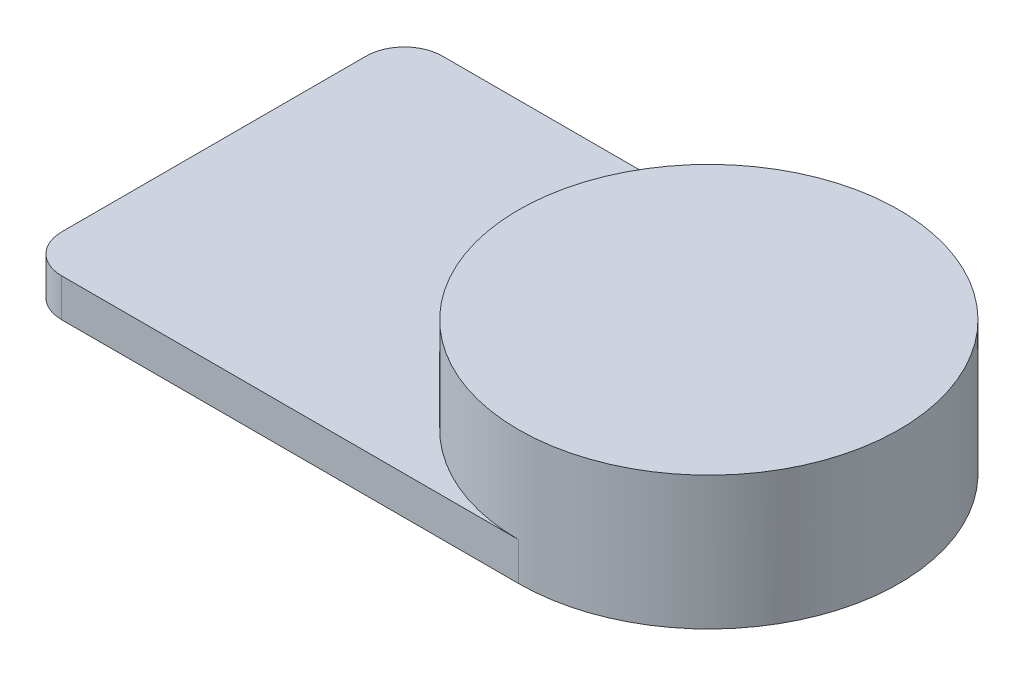
ISO-10303-21;
HEADER;
FILE_DESCRIPTION(('STEP AP214'),'2;1');
FILE_NAME('part.step','',(''),(''),'','','');
FILE_SCHEMA(('AUTOMOTIVE_DESIGN { 1 0 10303 214 1 1 1 1 }'));
ENDSEC;
DATA;
#1=APPLICATION_CONTEXT('core data for automotive mechanical design processes');
#2=APPLICATION_PROTOCOL_DEFINITION('international standard','automotive_design',2000,#1);
#3=PRODUCT_CONTEXT('',#1,'mechanical');
#4=PRODUCT('Part','Part','',(#3));
#5=PRODUCT_RELATED_PRODUCT_CATEGORY('part','',(#4));
#6=PRODUCT_DEFINITION_FORMATION('','',#4);
#7=PRODUCT_DEFINITION_CONTEXT('part definition',#1,'design');
#8=PRODUCT_DEFINITION('design','',#6,#7);
#9=PRODUCT_DEFINITION_SHAPE('','',#8);
#10=(LENGTH_UNIT() NAMED_UNIT(*) SI_UNIT(.MILLI.,.METRE.));
#11=(NAMED_UNIT(*) PLANE_ANGLE_UNIT() SI_UNIT($,.RADIAN.));
#12=(NAMED_UNIT(*) SI_UNIT($,.STERADIAN.) SOLID_ANGLE_UNIT());
#13=UNCERTAINTY_MEASURE_WITH_UNIT(LENGTH_MEASURE(1.E-05),#10,'distance_accuracy_value','');
#14=(GEOMETRIC_REPRESENTATION_CONTEXT(3) GLOBAL_UNCERTAINTY_ASSIGNED_CONTEXT((#13)) GLOBAL_UNIT_ASSIGNED_CONTEXT((#10,
#11,#12)) REPRESENTATION_CONTEXT('',''));
#15=CARTESIAN_POINT('',(0.,0.,0.));
#16=DIRECTION('',(0.,0.,1.));
#17=DIRECTION('',(1.,0.,0.));
#18=AXIS2_PLACEMENT_3D('',#15,#16,#17);
#19=CARTESIAN_POINT('',(0.,10.,50.));
#20=DIRECTION('',(0.,0.,1.));
#21=DIRECTION('',(1.,0.,0.));
#22=AXIS2_PLACEMENT_3D('',#19,#20,#21);
#23=PLANE('',#22);
#24=DIRECTION('',(-1.,0.,0.));
#25=VECTOR('',#24,1.);
#26=CARTESIAN_POINT('',(0.,10.,50.));
#27=LINE('',#26,#25);
#28=CARTESIAN_POINT('',(0.,10.,50.));
#29=VERTEX_POINT('',#28);
#30=CARTESIAN_POINT('',(-120.,10.,50.));
#31=VERTEX_POINT('',#30);
#32=EDGE_CURVE('E88',#29,#31,#27,.T.);
#33=ORIENTED_EDGE('',*,*,#32,.T.);
#34=DIRECTION('',(0.,-1.,0.));
#35=VECTOR('',#34,1.);
#36=CARTESIAN_POINT('',(-120.,0.,50.));
#37=LINE('',#36,#35);
#38=CARTESIAN_POINT('',(-120.,0.,50.));
#39=VERTEX_POINT('',#38);
#40=EDGE_CURVE('E11',#31,#39,#37,.T.);
#41=ORIENTED_EDGE('',*,*,#40,.T.);
#42=DIRECTION('',(-1.,0.,0.));
#43=VECTOR('',#42,1.);
#44=CARTESIAN_POINT('',(0.,0.,50.));
#45=LINE('',#44,#43);
#46=CARTESIAN_POINT('',(0.,0.,50.));
#47=VERTEX_POINT('',#46);
#48=EDGE_CURVE('E102',#47,#39,#45,.T.);
#49=ORIENTED_EDGE('',*,*,#48,.F.);
#50=DIRECTION('',(0.,-1.,0.));
#51=VECTOR('',#50,1.);
#52=CARTESIAN_POINT('',(0.,10.,50.));
#53=LINE('',#52,#51);
#54=EDGE_CURVE('E100',#29,#47,#53,.T.);
#55=ORIENTED_EDGE('',*,*,#54,.F.);
#56=EDGE_LOOP('',(#33,#41,#49,#55));
#57=FACE_BOUND('',#56,.T.);
#58=ADVANCED_FACE('F35',(#57),#23,.T.);
#59=CARTESIAN_POINT('',(0.,10.,0.));
#60=DIRECTION('',(0.,-1.,0.));
#61=DIRECTION('',(0.,0.,-1.));
#62=AXIS2_PLACEMENT_3D('',#59,#60,#61);
#63=CYLINDRICAL_SURFACE('',#62,50.);
#64=CARTESIAN_POINT('',(0.,0.,0.));
#65=DIRECTION('',(0.,1.,0.));
#66=DIRECTION('',(0.,0.,1.));
#67=AXIS2_PLACEMENT_3D('',#64,#65,#66);
#68=CIRCLE('',#67,50.);
#69=CARTESIAN_POINT('',(0.,0.,-50.));
#70=VERTEX_POINT('',#69);
#71=EDGE_CURVE('E122',#47,#70,#68,.T.);
#72=ORIENTED_EDGE('',*,*,#71,.T.);
#73=DIRECTION('',(0.,-1.,0.));
#74=VECTOR('',#73,1.);
#75=CARTESIAN_POINT('',(0.,10.,-50.));
#76=LINE('',#75,#74);
#77=CARTESIAN_POINT('',(0.,10.,-50.));
#78=VERTEX_POINT('',#77);
#79=EDGE_CURVE('E105',#78,#70,#76,.T.);
#80=ORIENTED_EDGE('',*,*,#79,.F.);
#81=CARTESIAN_POINT('',(0.,10.,0.));
#82=DIRECTION('',(0.,1.,0.));
#83=DIRECTION('',(0.,0.,1.));
#84=AXIS2_PLACEMENT_3D('',#81,#82,#83);
#85=CIRCLE('',#84,50.);
#86=EDGE_CURVE('E92',#78,#29,#85,.T.);
#87=ORIENTED_EDGE('',*,*,#86,.T.);
#88=ORIENTED_EDGE('',*,*,#54,.T.);
#89=EDGE_LOOP('',(#72,#80,#87,#88));
#90=FACE_BOUND('',#89,.T.);
#91=CARTESIAN_POINT('',(0.,35.,0.));
#92=DIRECTION('',(0.,1.,0.));
#93=DIRECTION('',(0.,0.,1.));
#94=AXIS2_PLACEMENT_3D('',#91,#92,#93);
#95=CIRCLE('',#94,50.);
#96=CARTESIAN_POINT('',(0.,35.,50.));
#97=VERTEX_POINT('',#96);
#98=EDGE_CURVE('E115',#97,#97,#95,.T.);
#99=ORIENTED_EDGE('',*,*,#98,.F.);
#100=EDGE_LOOP('',(#99));
#101=FACE_BOUND('',#100,.T.);
#102=ADVANCED_FACE('F107',(#90,#101),#63,.T.);
#103=CARTESIAN_POINT('',(0.,10.,-50.));
#104=DIRECTION('',(0.,0.,1.));
#105=DIRECTION('',(1.,0.,0.));
#106=AXIS2_PLACEMENT_3D('',#103,#104,#105);
#107=PLANE('',#106);
#108=DIRECTION('',(-1.,0.,0.));
#109=VECTOR('',#108,1.);
#110=CARTESIAN_POINT('',(0.,0.,-50.));
#111=LINE('',#110,#109);
#112=CARTESIAN_POINT('',(-120.,0.,-50.));
#113=VERTEX_POINT('',#112);
#114=EDGE_CURVE('E124',#70,#113,#111,.T.);
#115=ORIENTED_EDGE('',*,*,#114,.T.);
#116=DIRECTION('',(0.,-1.,0.));
#117=VECTOR('',#116,1.);
#118=CARTESIAN_POINT('',(-120.,10.,-50.));
#119=LINE('',#118,#117);
#120=CARTESIAN_POINT('',(-120.,10.,-50.));
#121=VERTEX_POINT('',#120);
#122=EDGE_CURVE('E58',#113,#121,#119,.F.);
#123=ORIENTED_EDGE('',*,*,#122,.T.);
#124=DIRECTION('',(-1.,0.,0.));
#125=VECTOR('',#124,1.);
#126=CARTESIAN_POINT('',(0.,10.,-50.));
#127=LINE('',#126,#125);
#128=EDGE_CURVE('E96',#78,#121,#127,.T.);
#129=ORIENTED_EDGE('',*,*,#128,.F.);
#130=ORIENTED_EDGE('',*,*,#79,.T.);
#131=EDGE_LOOP('',(#115,#123,#129,#130));
#132=FACE_BOUND('',#131,.T.);
#133=ADVANCED_FACE('F148',(#132),#107,.F.);
#134=CARTESIAN_POINT('',(-130.,10.,0.));
#135=DIRECTION('',(1.,0.,0.));
#136=DIRECTION('',(0.,0.,-1.));
#137=AXIS2_PLACEMENT_3D('',#134,#135,#136);
#138=PLANE('',#137);
#139=DIRECTION('',(0.,0.,1.));
#140=VECTOR('',#139,1.);
#141=CARTESIAN_POINT('',(-130.,10.,0.));
#142=LINE('',#141,#140);
#143=CARTESIAN_POINT('',(-130.,10.,-40.));
#144=VERTEX_POINT('',#143);
#145=CARTESIAN_POINT('',(-130.,10.,40.));
#146=VERTEX_POINT('',#145);
#147=EDGE_CURVE('E119',#144,#146,#142,.T.);
#148=ORIENTED_EDGE('',*,*,#147,.F.);
#149=DIRECTION('',(0.,-1.,0.));
#150=VECTOR('',#149,1.);
#151=CARTESIAN_POINT('',(-130.,10.,-40.));
#152=LINE('',#151,#150);
#153=CARTESIAN_POINT('',(-130.,0.,-40.));
#154=VERTEX_POINT('',#153);
#155=EDGE_CURVE('E112',#144,#154,#152,.T.);
#156=ORIENTED_EDGE('',*,*,#155,.T.);
#157=DIRECTION('',(0.,0.,1.));
#158=VECTOR('',#157,1.);
#159=CARTESIAN_POINT('',(-130.,0.,0.));
#160=LINE('',#159,#158);
#161=CARTESIAN_POINT('',(-130.,0.,40.));
#162=VERTEX_POINT('',#161);
#163=EDGE_CURVE('E97',#154,#162,#160,.T.);
#164=ORIENTED_EDGE('',*,*,#163,.T.);
#165=DIRECTION('',(0.,-1.,0.));
#166=VECTOR('',#165,1.);
#167=CARTESIAN_POINT('',(-130.,10.,40.));
#168=LINE('',#167,#166);
#169=EDGE_CURVE('E110',#162,#146,#168,.F.);
#170=ORIENTED_EDGE('',*,*,#169,.T.);
#171=EDGE_LOOP('',(#148,#156,#164,#170));
#172=FACE_BOUND('',#171,.T.);
#173=ADVANCED_FACE('F141',(#172),#138,.F.);
#174=CARTESIAN_POINT('',(0.,10.,0.));
#175=DIRECTION('',(0.,1.,0.));
#176=DIRECTION('',(0.,0.,1.));
#177=AXIS2_PLACEMENT_3D('',#174,#175,#176);
#178=PLANE('',#177);
#179=ORIENTED_EDGE('',*,*,#128,.T.);
#180=CARTESIAN_POINT('',(-120.,10.,-40.));
#181=DIRECTION('',(0.,1.,0.));
#182=DIRECTION('',(0.,0.,1.));
#183=AXIS2_PLACEMENT_3D('',#180,#181,#182);
#184=CIRCLE('',#183,10.);
#185=EDGE_CURVE('E43',#121,#144,#184,.T.);
#186=ORIENTED_EDGE('',*,*,#185,.T.);
#187=ORIENTED_EDGE('',*,*,#147,.T.);
#188=CARTESIAN_POINT('',(-120.,10.,40.));
#189=DIRECTION('',(0.,1.,0.));
#190=DIRECTION('',(0.,0.,1.));
#191=AXIS2_PLACEMENT_3D('',#188,#189,#190);
#192=CIRCLE('',#191,10.);
#193=EDGE_CURVE('E50',#146,#31,#192,.T.);
#194=ORIENTED_EDGE('',*,*,#193,.T.);
#195=ORIENTED_EDGE('',*,*,#32,.F.);
#196=ORIENTED_EDGE('',*,*,#86,.F.);
#197=EDGE_LOOP('',(#179,#186,#187,#194,#195,#196));
#198=FACE_BOUND('',#197,.T.);
#199=ADVANCED_FACE('F90',(#198),#178,.T.);
#200=CARTESIAN_POINT('',(0.,0.,0.));
#201=DIRECTION('',(0.,1.,0.));
#202=DIRECTION('',(0.,0.,1.));
#203=AXIS2_PLACEMENT_3D('',#200,#201,#202);
#204=PLANE('',#203);
#205=CARTESIAN_POINT('',(-115.,0.,-40.));
#206=DIRECTION('',(0.,-1.,0.));
#207=DIRECTION('',(0.,0.,-1.));
#208=AXIS2_PLACEMENT_3D('',#205,#206,#207);
#209=CIRCLE('',#208,5.00000000000001);
#210=CARTESIAN_POINT('',(-115.,0.,-45.));
#211=VERTEX_POINT('',#210);
#212=EDGE_CURVE('E202',#211,#211,#209,.T.);
#213=ORIENTED_EDGE('',*,*,#212,.F.);
#214=EDGE_LOOP('',(#213));
#215=FACE_BOUND('',#214,.T.);
#216=CARTESIAN_POINT('',(-15.,0.,-40.));
#217=DIRECTION('',(0.,-1.,0.));
#218=DIRECTION('',(0.,0.,-1.));
#219=AXIS2_PLACEMENT_3D('',#216,#217,#218);
#220=CIRCLE('',#219,5.);
#221=CARTESIAN_POINT('',(-15.,0.,-45.));
#222=VERTEX_POINT('',#221);
#223=EDGE_CURVE('E206',#222,#222,#220,.T.);
#224=ORIENTED_EDGE('',*,*,#223,.F.);
#225=EDGE_LOOP('',(#224));
#226=FACE_BOUND('',#225,.T.);
#227=CARTESIAN_POINT('',(-15.,0.,40.));
#228=DIRECTION('',(0.,-1.,0.));
#229=DIRECTION('',(0.,0.,-1.));
#230=AXIS2_PLACEMENT_3D('',#227,#228,#229);
#231=CIRCLE('',#230,5.);
#232=CARTESIAN_POINT('',(-15.,0.,35.));
#233=VERTEX_POINT('',#232);
#234=EDGE_CURVE('E210',#233,#233,#231,.T.);
#235=ORIENTED_EDGE('',*,*,#234,.F.);
#236=EDGE_LOOP('',(#235));
#237=FACE_BOUND('',#236,.T.);
#238=CARTESIAN_POINT('',(-115.,0.,40.));
#239=DIRECTION('',(0.,-1.,0.));
#240=DIRECTION('',(0.,0.,-1.));
#241=AXIS2_PLACEMENT_3D('',#238,#239,#240);
#242=CIRCLE('',#241,5.00000000000001);
#243=CARTESIAN_POINT('',(-115.,0.,35.));
#244=VERTEX_POINT('',#243);
#245=EDGE_CURVE('E213',#244,#244,#242,.T.);
#246=ORIENTED_EDGE('',*,*,#245,.F.);
#247=EDGE_LOOP('',(#246));
#248=FACE_BOUND('',#247,.T.);
#249=ORIENTED_EDGE('',*,*,#163,.F.);
#250=CARTESIAN_POINT('',(-120.,0.,-40.));
#251=DIRECTION('',(0.,1.,0.));
#252=DIRECTION('',(0.,0.,1.));
#253=AXIS2_PLACEMENT_3D('',#250,#251,#252);
#254=CIRCLE('',#253,10.);
#255=EDGE_CURVE('E133',#154,#113,#254,.F.);
#256=ORIENTED_EDGE('',*,*,#255,.T.);
#257=ORIENTED_EDGE('',*,*,#114,.F.);
#258=ORIENTED_EDGE('',*,*,#71,.F.);
#259=ORIENTED_EDGE('',*,*,#48,.T.);
#260=CARTESIAN_POINT('',(-120.,0.,40.));
#261=DIRECTION('',(0.,1.,0.));
#262=DIRECTION('',(0.,0.,1.));
#263=AXIS2_PLACEMENT_3D('',#260,#261,#262);
#264=CIRCLE('',#263,10.);
#265=EDGE_CURVE('E131',#39,#162,#264,.F.);
#266=ORIENTED_EDGE('',*,*,#265,.T.);
#267=EDGE_LOOP('',(#249,#256,#257,#258,#259,#266));
#268=FACE_BOUND('',#267,.T.);
#269=ADVANCED_FACE('F147',(#215,#226,#237,#248,#268),#204,.F.);
#270=CARTESIAN_POINT('',(0.,35.,0.));
#271=DIRECTION('',(0.,1.,0.));
#272=DIRECTION('',(0.,0.,1.));
#273=AXIS2_PLACEMENT_3D('',#270,#271,#272);
#274=PLANE('',#273);
#275=ORIENTED_EDGE('',*,*,#98,.T.);
#276=EDGE_LOOP('',(#275));
#277=FACE_BOUND('',#276,.T.);
#278=ADVANCED_FACE('F188',(#277),#274,.T.);
#279=CARTESIAN_POINT('',(-115.,5.,40.));
#280=DIRECTION('',(0.,-1.,0.));
#281=DIRECTION('',(0.,0.,-1.));
#282=AXIS2_PLACEMENT_3D('',#279,#280,#281);
#283=CYLINDRICAL_SURFACE('',#282,5.00000000000001);
#284=CARTESIAN_POINT('',(-115.,5.,40.));
#285=DIRECTION('',(0.,-1.,0.));
#286=DIRECTION('',(0.,0.,-1.));
#287=AXIS2_PLACEMENT_3D('',#284,#285,#286);
#288=CIRCLE('',#287,5.00000000000001);
#289=CARTESIAN_POINT('',(-115.,5.,35.));
#290=VERTEX_POINT('',#289);
#291=EDGE_CURVE('E215',#290,#290,#288,.T.);
#292=ORIENTED_EDGE('',*,*,#291,.F.);
#293=EDGE_LOOP('',(#292));
#294=FACE_BOUND('',#293,.T.);
#295=ORIENTED_EDGE('',*,*,#245,.T.);
#296=EDGE_LOOP('',(#295));
#297=FACE_BOUND('',#296,.T.);
#298=ADVANCED_FACE('F184',(#294,#297),#283,.F.);
#299=CARTESIAN_POINT('',(-115.,5.,40.));
#300=DIRECTION('',(0.,-1.,0.));
#301=DIRECTION('',(0.,0.,-1.));
#302=AXIS2_PLACEMENT_3D('',#299,#300,#301);
#303=PLANE('',#302);
#304=ORIENTED_EDGE('',*,*,#291,.T.);
#305=EDGE_LOOP('',(#304));
#306=FACE_BOUND('',#305,.T.);
#307=ADVANCED_FACE('F180',(#306),#303,.T.);
#308=CARTESIAN_POINT('',(-15.,5.,40.));
#309=DIRECTION('',(0.,-1.,0.));
#310=DIRECTION('',(0.,0.,-1.));
#311=AXIS2_PLACEMENT_3D('',#308,#309,#310);
#312=CYLINDRICAL_SURFACE('',#311,5.);
#313=CARTESIAN_POINT('',(-15.,5.,40.));
#314=DIRECTION('',(0.,-1.,0.));
#315=DIRECTION('',(0.,0.,-1.));
#316=AXIS2_PLACEMENT_3D('',#313,#314,#315);
#317=CIRCLE('',#316,5.);
#318=CARTESIAN_POINT('',(-15.,5.,35.));
#319=VERTEX_POINT('',#318);
#320=EDGE_CURVE('E218',#319,#319,#317,.T.);
#321=ORIENTED_EDGE('',*,*,#320,.F.);
#322=EDGE_LOOP('',(#321));
#323=FACE_BOUND('',#322,.T.);
#324=ORIENTED_EDGE('',*,*,#234,.T.);
#325=EDGE_LOOP('',(#324));
#326=FACE_BOUND('',#325,.T.);
#327=ADVANCED_FACE('F183',(#323,#326),#312,.F.);
#328=CARTESIAN_POINT('',(-15.,5.,40.));
#329=DIRECTION('',(0.,-1.,0.));
#330=DIRECTION('',(0.,0.,-1.));
#331=AXIS2_PLACEMENT_3D('',#328,#329,#330);
#332=PLANE('',#331);
#333=ORIENTED_EDGE('',*,*,#320,.T.);
#334=EDGE_LOOP('',(#333));
#335=FACE_BOUND('',#334,.T.);
#336=ADVANCED_FACE('F231',(#335),#332,.T.);
#337=CARTESIAN_POINT('',(-15.,5.,-40.));
#338=DIRECTION('',(0.,-1.,0.));
#339=DIRECTION('',(0.,0.,-1.));
#340=AXIS2_PLACEMENT_3D('',#337,#338,#339);
#341=CYLINDRICAL_SURFACE('',#340,5.);
#342=CARTESIAN_POINT('',(-15.,5.,-40.));
#343=DIRECTION('',(0.,-1.,0.));
#344=DIRECTION('',(0.,0.,-1.));
#345=AXIS2_PLACEMENT_3D('',#342,#343,#344);
#346=CIRCLE('',#345,5.);
#347=CARTESIAN_POINT('',(-15.,5.,-45.));
#348=VERTEX_POINT('',#347);
#349=EDGE_CURVE('E224',#348,#348,#346,.T.);
#350=ORIENTED_EDGE('',*,*,#349,.F.);
#351=EDGE_LOOP('',(#350));
#352=FACE_BOUND('',#351,.T.);
#353=ORIENTED_EDGE('',*,*,#223,.T.);
#354=EDGE_LOOP('',(#353));
#355=FACE_BOUND('',#354,.T.);
#356=ADVANCED_FACE('F239',(#352,#355),#341,.F.);
#357=CARTESIAN_POINT('',(-15.,5.,-40.));
#358=DIRECTION('',(0.,-1.,0.));
#359=DIRECTION('',(0.,0.,-1.));
#360=AXIS2_PLACEMENT_3D('',#357,#358,#359);
#361=PLANE('',#360);
#362=ORIENTED_EDGE('',*,*,#349,.T.);
#363=EDGE_LOOP('',(#362));
#364=FACE_BOUND('',#363,.T.);
#365=ADVANCED_FACE('F174',(#364),#361,.T.);
#366=CARTESIAN_POINT('',(-115.,5.,-40.));
#367=DIRECTION('',(0.,-1.,0.));
#368=DIRECTION('',(0.,0.,-1.));
#369=AXIS2_PLACEMENT_3D('',#366,#367,#368);
#370=CYLINDRICAL_SURFACE('',#369,5.00000000000001);
#371=CARTESIAN_POINT('',(-115.,5.,-40.));
#372=DIRECTION('',(0.,-1.,0.));
#373=DIRECTION('',(0.,0.,-1.));
#374=AXIS2_PLACEMENT_3D('',#371,#372,#373);
#375=CIRCLE('',#374,5.00000000000001);
#376=CARTESIAN_POINT('',(-115.,5.,-45.));
#377=VERTEX_POINT('',#376);
#378=EDGE_CURVE('E221',#377,#377,#375,.T.);
#379=ORIENTED_EDGE('',*,*,#378,.F.);
#380=EDGE_LOOP('',(#379));
#381=FACE_BOUND('',#380,.T.);
#382=ORIENTED_EDGE('',*,*,#212,.T.);
#383=EDGE_LOOP('',(#382));
#384=FACE_BOUND('',#383,.T.);
#385=ADVANCED_FACE('F169',(#381,#384),#370,.F.);
#386=CARTESIAN_POINT('',(-115.,5.,-40.));
#387=DIRECTION('',(0.,-1.,0.));
#388=DIRECTION('',(0.,0.,-1.));
#389=AXIS2_PLACEMENT_3D('',#386,#387,#388);
#390=PLANE('',#389);
#391=ORIENTED_EDGE('',*,*,#378,.T.);
#392=EDGE_LOOP('',(#391));
#393=FACE_BOUND('',#392,.T.);
#394=ADVANCED_FACE('F163',(#393),#390,.T.);
#395=CARTESIAN_POINT('',(-120.,10.,-40.));
#396=DIRECTION('',(0.,-1.,0.));
#397=DIRECTION('',(0.,0.,-1.));
#398=AXIS2_PLACEMENT_3D('',#395,#396,#397);
#399=CYLINDRICAL_SURFACE('',#398,10.);
#400=ORIENTED_EDGE('',*,*,#185,.F.);
#401=ORIENTED_EDGE('',*,*,#122,.F.);
#402=ORIENTED_EDGE('',*,*,#255,.F.);
#403=ORIENTED_EDGE('',*,*,#155,.F.);
#404=EDGE_LOOP('',(#400,#401,#402,#403));
#405=FACE_BOUND('',#404,.T.);
#406=ADVANCED_FACE('F144',(#405),#399,.T.);
#407=CARTESIAN_POINT('',(-120.,10.,40.));
#408=DIRECTION('',(0.,1.,0.));
#409=DIRECTION('',(0.,0.,1.));
#410=AXIS2_PLACEMENT_3D('',#407,#408,#409);
#411=CYLINDRICAL_SURFACE('',#410,10.);
#412=ORIENTED_EDGE('',*,*,#193,.F.);
#413=ORIENTED_EDGE('',*,*,#169,.F.);
#414=ORIENTED_EDGE('',*,*,#265,.F.);
#415=ORIENTED_EDGE('',*,*,#40,.F.);
#416=EDGE_LOOP('',(#412,#413,#414,#415));
#417=FACE_BOUND('',#416,.T.);
#418=ADVANCED_FACE('F37',(#417),#411,.T.);
#419=CLOSED_SHELL('',(#58,#102,#133,#173,#199,#269,#278,#298,#307,#327,#336,#356,#365,#385,#394,
#406,#418));
#420=MANIFOLD_SOLID_BREP('B2',#419);
#421=ADVANCED_BREP_SHAPE_REPRESENTATION('',(#18,#420),#14);
#422=SHAPE_DEFINITION_REPRESENTATION(#9,#421);
ENDSEC;
END-ISO-10303-21;
